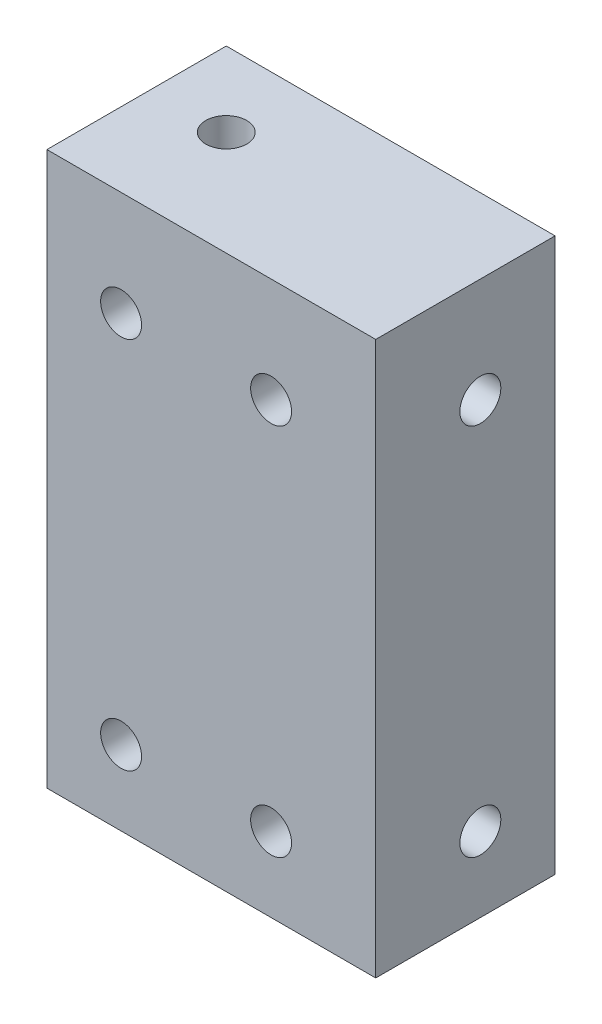
ISO-10303-21;
HEADER;
FILE_DESCRIPTION(('STEP AP214'),'2;1');
FILE_NAME('part.step','',(''),(''),'','','');
FILE_SCHEMA(('AUTOMOTIVE_DESIGN { 1 0 10303 214 1 1 1 1 }'));
ENDSEC;
DATA;
#1=APPLICATION_CONTEXT('core data for automotive mechanical design processes');
#2=APPLICATION_PROTOCOL_DEFINITION('international standard','automotive_design',2000,#1);
#3=PRODUCT_CONTEXT('',#1,'mechanical');
#4=PRODUCT('Part','Part','',(#3));
#5=PRODUCT_RELATED_PRODUCT_CATEGORY('part','',(#4));
#6=PRODUCT_DEFINITION_FORMATION('','',#4);
#7=PRODUCT_DEFINITION_CONTEXT('part definition',#1,'design');
#8=PRODUCT_DEFINITION('design','',#6,#7);
#9=PRODUCT_DEFINITION_SHAPE('','',#8);
#10=(LENGTH_UNIT() NAMED_UNIT(*) SI_UNIT(.MILLI.,.METRE.));
#11=(NAMED_UNIT(*) PLANE_ANGLE_UNIT() SI_UNIT($,.RADIAN.));
#12=(NAMED_UNIT(*) SI_UNIT($,.STERADIAN.) SOLID_ANGLE_UNIT());
#13=UNCERTAINTY_MEASURE_WITH_UNIT(LENGTH_MEASURE(1.E-05),#10,'distance_accuracy_value','');
#14=(GEOMETRIC_REPRESENTATION_CONTEXT(3) GLOBAL_UNCERTAINTY_ASSIGNED_CONTEXT((#13)) GLOBAL_UNIT_ASSIGNED_CONTEXT((#10,
#11,#12)) REPRESENTATION_CONTEXT('',''));
#15=CARTESIAN_POINT('',(0.,0.,0.));
#16=DIRECTION('',(0.,0.,1.));
#17=DIRECTION('',(1.,0.,0.));
#18=AXIS2_PLACEMENT_3D('',#15,#16,#17);
#19=CARTESIAN_POINT('',(0.,0.,4.));
#20=DIRECTION('',(0.,0.,-1.));
#21=DIRECTION('',(-1.,0.,0.));
#22=AXIS2_PLACEMENT_3D('',#19,#20,#21);
#23=PLANE('',#22);
#24=DIRECTION('',(1.,0.,0.));
#25=VECTOR('',#24,1.);
#26=CARTESIAN_POINT('',(-229.06817954727,-521.277483232161,4.));
#27=LINE('',#26,#25);
#28=CARTESIAN_POINT('',(-229.06817954727,-521.277483232161,4.));
#29=VERTEX_POINT('',#28);
#30=CARTESIAN_POINT('',(-185.06817954727,-521.27748323216,3.99999999999999));
#31=VERTEX_POINT('',#30);
#32=EDGE_CURVE('E42',#29,#31,#27,.T.);
#33=ORIENTED_EDGE('',*,*,#32,.T.);
#34=DIRECTION('',(0.,-1.,0.));
#35=VECTOR('',#34,1.);
#36=CARTESIAN_POINT('',(-185.06817954727,-447.27748323216,4.));
#37=LINE('',#36,#35);
#38=CARTESIAN_POINT('',(-185.06817954727,-447.27748323216,4.));
#39=VERTEX_POINT('',#38);
#40=EDGE_CURVE('E144',#39,#31,#37,.T.);
#41=ORIENTED_EDGE('',*,*,#40,.F.);
#42=DIRECTION('',(1.,0.,0.));
#43=VECTOR('',#42,1.);
#44=CARTESIAN_POINT('',(-229.06817954727,-447.27748323216,4.));
#45=LINE('',#44,#43);
#46=CARTESIAN_POINT('',(-229.06817954727,-447.27748323216,4.));
#47=VERTEX_POINT('',#46);
#48=EDGE_CURVE('E127',#47,#39,#45,.T.);
#49=ORIENTED_EDGE('',*,*,#48,.F.);
#50=DIRECTION('',(0.,-1.,0.));
#51=VECTOR('',#50,1.);
#52=CARTESIAN_POINT('',(-229.06817954727,-521.277483232161,4.));
#53=LINE('',#52,#51);
#54=EDGE_CURVE('E49',#47,#29,#53,.T.);
#55=ORIENTED_EDGE('',*,*,#54,.T.);
#56=EDGE_LOOP('',(#33,#41,#49,#55));
#57=FACE_BOUND('',#56,.T.);
#58=CARTESIAN_POINT('',(-199.06817954727,-461.27748323216,4.));
#59=DIRECTION('',(0.,0.,1.));
#60=DIRECTION('',(1.,0.,0.));
#61=AXIS2_PLACEMENT_3D('',#58,#59,#60);
#62=CIRCLE('',#61,2.73999999999999);
#63=CARTESIAN_POINT('',(-196.32817954727,-461.27748323216,4.));
#64=VERTEX_POINT('',#63);
#65=EDGE_CURVE('E88',#64,#64,#62,.T.);
#66=ORIENTED_EDGE('',*,*,#65,.F.);
#67=EDGE_LOOP('',(#66));
#68=FACE_BOUND('',#67,.T.);
#69=CARTESIAN_POINT('',(-219.139101533085,-461.27748323216,4.));
#70=DIRECTION('',(0.,0.,1.));
#71=DIRECTION('',(1.,0.,0.));
#72=AXIS2_PLACEMENT_3D('',#69,#70,#71);
#73=CIRCLE('',#72,2.73999999999999);
#74=CARTESIAN_POINT('',(-216.399101533085,-461.27748323216,4.));
#75=VERTEX_POINT('',#74);
#76=EDGE_CURVE('E93',#75,#75,#73,.T.);
#77=ORIENTED_EDGE('',*,*,#76,.F.);
#78=EDGE_LOOP('',(#77));
#79=FACE_BOUND('',#78,.T.);
#80=CARTESIAN_POINT('',(-219.139101533085,-511.27748323216,4.));
#81=DIRECTION('',(0.,0.,1.));
#82=DIRECTION('',(1.,0.,0.));
#83=AXIS2_PLACEMENT_3D('',#80,#81,#82);
#84=CIRCLE('',#83,2.74000000000006);
#85=CARTESIAN_POINT('',(-216.399101533085,-511.27748323216,4.));
#86=VERTEX_POINT('',#85);
#87=EDGE_CURVE('E99',#86,#86,#84,.T.);
#88=ORIENTED_EDGE('',*,*,#87,.F.);
#89=EDGE_LOOP('',(#88));
#90=FACE_BOUND('',#89,.T.);
#91=CARTESIAN_POINT('',(-199.06817954727,-511.27748323216,4.));
#92=DIRECTION('',(0.,0.,1.));
#93=DIRECTION('',(1.,0.,0.));
#94=AXIS2_PLACEMENT_3D('',#91,#92,#93);
#95=CIRCLE('',#94,2.74000000000009);
#96=CARTESIAN_POINT('',(-196.32817954727,-511.27748323216,4.));
#97=VERTEX_POINT('',#96);
#98=EDGE_CURVE('E105',#97,#97,#95,.T.);
#99=ORIENTED_EDGE('',*,*,#98,.F.);
#100=EDGE_LOOP('',(#99));
#101=FACE_BOUND('',#100,.T.);
#102=ADVANCED_FACE('F33',(#57,#68,#79,#90,#101),#23,.F.);
#103=CARTESIAN_POINT('',(0.,0.,0.));
#104=DIRECTION('',(0.,0.,-1.));
#105=DIRECTION('',(-1.,0.,0.));
#106=AXIS2_PLACEMENT_3D('',#103,#104,#105);
#107=PLANE('',#106);
#108=CARTESIAN_POINT('',(-219.139101533085,-511.27748323216,0.));
#109=DIRECTION('',(0.,0.,1.));
#110=DIRECTION('',(1.,0.,0.));
#111=AXIS2_PLACEMENT_3D('',#108,#109,#110);
#112=CIRCLE('',#111,2.74000000000006);
#113=CARTESIAN_POINT('',(-216.399101533085,-511.27748323216,0.));
#114=VERTEX_POINT('',#113);
#115=EDGE_CURVE('E102',#114,#114,#112,.T.);
#116=ORIENTED_EDGE('',*,*,#115,.T.);
#117=EDGE_LOOP('',(#116));
#118=FACE_BOUND('',#117,.T.);
#119=CARTESIAN_POINT('',(-199.06817954727,-461.27748323216,0.));
#120=DIRECTION('',(0.,0.,1.));
#121=DIRECTION('',(1.,0.,0.));
#122=AXIS2_PLACEMENT_3D('',#119,#120,#121);
#123=CIRCLE('',#122,2.73999999999999);
#124=CARTESIAN_POINT('',(-196.32817954727,-461.27748323216,0.));
#125=VERTEX_POINT('',#124);
#126=EDGE_CURVE('E90',#125,#125,#123,.T.);
#127=ORIENTED_EDGE('',*,*,#126,.T.);
#128=EDGE_LOOP('',(#127));
#129=FACE_BOUND('',#128,.T.);
#130=DIRECTION('',(0.,1.,0.));
#131=VECTOR('',#130,1.);
#132=CARTESIAN_POINT('',(-189.06817954727,-521.277483232161,0.));
#133=LINE('',#132,#131);
#134=CARTESIAN_POINT('',(-189.06817954727,-521.277483232161,0.));
#135=VERTEX_POINT('',#134);
#136=CARTESIAN_POINT('',(-189.06817954727,-451.27748323216,0.));
#137=VERTEX_POINT('',#136);
#138=EDGE_CURVE('E82',#135,#137,#133,.T.);
#139=ORIENTED_EDGE('',*,*,#138,.F.);
#140=DIRECTION('',(1.,0.,0.));
#141=VECTOR('',#140,1.);
#142=CARTESIAN_POINT('',(-229.06817954727,-521.277483232161,0.));
#143=LINE('',#142,#141);
#144=CARTESIAN_POINT('',(-229.06817954727,-521.277483232161,0.));
#145=VERTEX_POINT('',#144);
#146=EDGE_CURVE('E71',#145,#135,#143,.T.);
#147=ORIENTED_EDGE('',*,*,#146,.F.);
#148=DIRECTION('',(0.,-1.,0.));
#149=VECTOR('',#148,1.);
#150=CARTESIAN_POINT('',(-229.06817954727,-521.277483232161,0.));
#151=LINE('',#150,#149);
#152=CARTESIAN_POINT('',(-229.06817954727,-451.27748323216,0.));
#153=VERTEX_POINT('',#152);
#154=EDGE_CURVE('E63',#153,#145,#151,.T.);
#155=ORIENTED_EDGE('',*,*,#154,.F.);
#156=DIRECTION('',(-1.,0.,0.));
#157=VECTOR('',#156,1.);
#158=CARTESIAN_POINT('',(-229.06817954727,-451.27748323216,0.));
#159=LINE('',#158,#157);
#160=EDGE_CURVE('E72',#137,#153,#159,.T.);
#161=ORIENTED_EDGE('',*,*,#160,.F.);
#162=EDGE_LOOP('',(#139,#147,#155,#161));
#163=FACE_BOUND('',#162,.T.);
#164=CARTESIAN_POINT('',(-219.139101533085,-461.27748323216,0.));
#165=DIRECTION('',(0.,0.,1.));
#166=DIRECTION('',(1.,0.,0.));
#167=AXIS2_PLACEMENT_3D('',#164,#165,#166);
#168=CIRCLE('',#167,2.73999999999999);
#169=CARTESIAN_POINT('',(-216.399101533085,-461.27748323216,0.));
#170=VERTEX_POINT('',#169);
#171=EDGE_CURVE('E96',#170,#170,#168,.T.);
#172=ORIENTED_EDGE('',*,*,#171,.T.);
#173=EDGE_LOOP('',(#172));
#174=FACE_BOUND('',#173,.T.);
#175=CARTESIAN_POINT('',(-199.06817954727,-511.27748323216,0.));
#176=DIRECTION('',(0.,0.,1.));
#177=DIRECTION('',(1.,0.,0.));
#178=AXIS2_PLACEMENT_3D('',#175,#176,#177);
#179=CIRCLE('',#178,2.74000000000009);
#180=CARTESIAN_POINT('',(-196.32817954727,-511.27748323216,0.));
#181=VERTEX_POINT('',#180);
#182=EDGE_CURVE('E108',#181,#181,#179,.T.);
#183=ORIENTED_EDGE('',*,*,#182,.T.);
#184=EDGE_LOOP('',(#183));
#185=FACE_BOUND('',#184,.T.);
#186=ADVANCED_FACE('F79',(#118,#129,#163,#174,#185),#107,.T.);
#187=CARTESIAN_POINT('',(-229.06817954727,-521.277483232161,4.));
#188=DIRECTION('',(1.,0.,0.));
#189=DIRECTION('',(0.,1.,0.));
#190=AXIS2_PLACEMENT_3D('',#187,#188,#189);
#191=PLANE('',#190);
#192=ORIENTED_EDGE('',*,*,#154,.T.);
#193=DIRECTION('',(0.,0.,-1.));
#194=VECTOR('',#193,1.);
#195=CARTESIAN_POINT('',(-229.06817954727,-521.277483232161,4.));
#196=LINE('',#195,#194);
#197=EDGE_CURVE('E11',#29,#145,#196,.T.);
#198=ORIENTED_EDGE('',*,*,#197,.F.);
#199=ORIENTED_EDGE('',*,*,#54,.F.);
#200=DIRECTION('',(0.,0.,1.));
#201=VECTOR('',#200,1.);
#202=CARTESIAN_POINT('',(-229.06817954727,-447.27748323216,4.));
#203=LINE('',#202,#201);
#204=CARTESIAN_POINT('',(-229.06817954727,-447.27748323216,-20.));
#205=VERTEX_POINT('',#204);
#206=EDGE_CURVE('E119',#205,#47,#203,.T.);
#207=ORIENTED_EDGE('',*,*,#206,.F.);
#208=DIRECTION('',(0.,-1.,0.));
#209=VECTOR('',#208,1.);
#210=CARTESIAN_POINT('',(-229.06817954727,-447.27748323216,-20.));
#211=LINE('',#210,#209);
#212=CARTESIAN_POINT('',(-229.06817954727,-451.27748323216,-20.));
#213=VERTEX_POINT('',#212);
#214=EDGE_CURVE('E111',#205,#213,#211,.T.);
#215=ORIENTED_EDGE('',*,*,#214,.T.);
#216=DIRECTION('',(0.,0.,1.));
#217=VECTOR('',#216,1.);
#218=CARTESIAN_POINT('',(-229.06817954727,-451.27748323216,4.));
#219=LINE('',#218,#217);
#220=EDGE_CURVE('E67',#213,#153,#219,.T.);
#221=ORIENTED_EDGE('',*,*,#220,.T.);
#222=EDGE_LOOP('',(#192,#198,#199,#207,#215,#221));
#223=FACE_BOUND('',#222,.T.);
#224=ADVANCED_FACE('F35',(#223),#191,.F.);
#225=CARTESIAN_POINT('',(-229.06817954727,-521.277483232161,4.));
#226=DIRECTION('',(0.,1.,0.));
#227=DIRECTION('',(0.,0.,1.));
#228=AXIS2_PLACEMENT_3D('',#225,#226,#227);
#229=PLANE('',#228);
#230=ORIENTED_EDGE('',*,*,#146,.T.);
#231=DIRECTION('',(0.,0.,-1.));
#232=VECTOR('',#231,1.);
#233=CARTESIAN_POINT('',(-189.06817954727,-521.27748323216,3.99999999999999));
#234=LINE('',#233,#232);
#235=CARTESIAN_POINT('',(-189.06817954727,-521.27748323216,-20.));
#236=VERTEX_POINT('',#235);
#237=EDGE_CURVE('E145',#135,#236,#234,.T.);
#238=ORIENTED_EDGE('',*,*,#237,.T.);
#239=DIRECTION('',(-1.,0.,0.));
#240=VECTOR('',#239,1.);
#241=CARTESIAN_POINT('',(-185.06817954727,-521.27748323216,-20.));
#242=LINE('',#241,#240);
#243=CARTESIAN_POINT('',(-185.06817954727,-521.27748323216,-20.));
#244=VERTEX_POINT('',#243);
#245=EDGE_CURVE('E135',#244,#236,#242,.T.);
#246=ORIENTED_EDGE('',*,*,#245,.F.);
#247=DIRECTION('',(0.,0.,-1.));
#248=VECTOR('',#247,1.);
#249=CARTESIAN_POINT('',(-185.06817954727,-521.27748323216,3.99999999999999));
#250=LINE('',#249,#248);
#251=EDGE_CURVE('E153',#31,#244,#250,.T.);
#252=ORIENTED_EDGE('',*,*,#251,.F.);
#253=ORIENTED_EDGE('',*,*,#32,.F.);
#254=ORIENTED_EDGE('',*,*,#197,.T.);
#255=EDGE_LOOP('',(#230,#238,#246,#252,#253,#254));
#256=FACE_BOUND('',#255,.T.);
#257=ADVANCED_FACE('F75',(#256),#229,.F.);
#258=CARTESIAN_POINT('',(-199.06817954727,-461.27748323216,4.));
#259=DIRECTION('',(0.,0.,-1.));
#260=DIRECTION('',(-1.,0.,0.));
#261=AXIS2_PLACEMENT_3D('',#258,#259,#260);
#262=CYLINDRICAL_SURFACE('',#261,2.73999999999999);
#263=ORIENTED_EDGE('',*,*,#65,.T.);
#264=EDGE_LOOP('',(#263));
#265=FACE_BOUND('',#264,.T.);
#266=ORIENTED_EDGE('',*,*,#126,.F.);
#267=EDGE_LOOP('',(#266));
#268=FACE_BOUND('',#267,.T.);
#269=ADVANCED_FACE('F201',(#265,#268),#262,.F.);
#270=CARTESIAN_POINT('',(-219.139101533085,-461.27748323216,4.));
#271=DIRECTION('',(0.,0.,-1.));
#272=DIRECTION('',(-1.,0.,0.));
#273=AXIS2_PLACEMENT_3D('',#270,#271,#272);
#274=CYLINDRICAL_SURFACE('',#273,2.73999999999999);
#275=ORIENTED_EDGE('',*,*,#76,.T.);
#276=EDGE_LOOP('',(#275));
#277=FACE_BOUND('',#276,.T.);
#278=ORIENTED_EDGE('',*,*,#171,.F.);
#279=EDGE_LOOP('',(#278));
#280=FACE_BOUND('',#279,.T.);
#281=ADVANCED_FACE('F208',(#277,#280),#274,.F.);
#282=CARTESIAN_POINT('',(-219.139101533085,-511.27748323216,4.));
#283=DIRECTION('',(0.,0.,-1.));
#284=DIRECTION('',(-1.,0.,0.));
#285=AXIS2_PLACEMENT_3D('',#282,#283,#284);
#286=CYLINDRICAL_SURFACE('',#285,2.74000000000006);
#287=ORIENTED_EDGE('',*,*,#87,.T.);
#288=EDGE_LOOP('',(#287));
#289=FACE_BOUND('',#288,.T.);
#290=ORIENTED_EDGE('',*,*,#115,.F.);
#291=EDGE_LOOP('',(#290));
#292=FACE_BOUND('',#291,.T.);
#293=ADVANCED_FACE('F304',(#289,#292),#286,.F.);
#294=CARTESIAN_POINT('',(-199.06817954727,-511.27748323216,4.));
#295=DIRECTION('',(0.,0.,-1.));
#296=DIRECTION('',(-1.,0.,0.));
#297=AXIS2_PLACEMENT_3D('',#294,#295,#296);
#298=CYLINDRICAL_SURFACE('',#297,2.74000000000009);
#299=ORIENTED_EDGE('',*,*,#98,.T.);
#300=EDGE_LOOP('',(#299));
#301=FACE_BOUND('',#300,.T.);
#302=ORIENTED_EDGE('',*,*,#182,.F.);
#303=EDGE_LOOP('',(#302));
#304=FACE_BOUND('',#303,.T.);
#305=ADVANCED_FACE('F221',(#301,#304),#298,.F.);
#306=CARTESIAN_POINT('',(0.,-447.27748323216,0.));
#307=DIRECTION('',(0.,-1.,0.));
#308=DIRECTION('',(0.,0.,-1.));
#309=AXIS2_PLACEMENT_3D('',#306,#307,#308);
#310=PLANE('',#309);
#311=ORIENTED_EDGE('',*,*,#206,.T.);
#312=ORIENTED_EDGE('',*,*,#48,.T.);
#313=DIRECTION('',(0.,0.,1.));
#314=VECTOR('',#313,1.);
#315=CARTESIAN_POINT('',(-185.06817954727,-447.27748323216,4.));
#316=LINE('',#315,#314);
#317=CARTESIAN_POINT('',(-185.06817954727,-447.27748323216,-20.));
#318=VERTEX_POINT('',#317);
#319=EDGE_CURVE('E140',#318,#39,#316,.T.);
#320=ORIENTED_EDGE('',*,*,#319,.F.);
#321=DIRECTION('',(-1.,0.,0.));
#322=VECTOR('',#321,1.);
#323=CARTESIAN_POINT('',(-229.06817954727,-447.27748323216,-20.));
#324=LINE('',#323,#322);
#325=EDGE_CURVE('E115',#318,#205,#324,.T.);
#326=ORIENTED_EDGE('',*,*,#325,.T.);
#327=EDGE_LOOP('',(#311,#312,#320,#326));
#328=FACE_BOUND('',#327,.T.);
#329=CARTESIAN_POINT('',(-219.06817954727,-447.27748323216,-10.));
#330=DIRECTION('',(0.,1.,0.));
#331=DIRECTION('',(0.,0.,1.));
#332=AXIS2_PLACEMENT_3D('',#329,#330,#331);
#333=CIRCLE('',#332,2.74);
#334=CARTESIAN_POINT('',(-219.06817954727,-447.27748323216,-7.26));
#335=VERTEX_POINT('',#334);
#336=EDGE_CURVE('E124',#335,#335,#333,.T.);
#337=ORIENTED_EDGE('',*,*,#336,.F.);
#338=EDGE_LOOP('',(#337));
#339=FACE_BOUND('',#338,.T.);
#340=ADVANCED_FACE('F251',(#328,#339),#310,.F.);
#341=CARTESIAN_POINT('',(0.,-451.27748323216,0.));
#342=DIRECTION('',(0.,-1.,0.));
#343=DIRECTION('',(0.,0.,-1.));
#344=AXIS2_PLACEMENT_3D('',#341,#342,#343);
#345=PLANE('',#344);
#346=DIRECTION('',(0.,0.,-1.));
#347=VECTOR('',#346,1.);
#348=CARTESIAN_POINT('',(-189.06817954727,-451.27748323216,4.));
#349=LINE('',#348,#347);
#350=CARTESIAN_POINT('',(-189.06817954727,-451.27748323216,-20.));
#351=VERTEX_POINT('',#350);
#352=EDGE_CURVE('E120',#137,#351,#349,.T.);
#353=ORIENTED_EDGE('',*,*,#352,.F.);
#354=ORIENTED_EDGE('',*,*,#160,.T.);
#355=ORIENTED_EDGE('',*,*,#220,.F.);
#356=DIRECTION('',(-1.,0.,0.));
#357=VECTOR('',#356,1.);
#358=CARTESIAN_POINT('',(-229.06817954727,-451.27748323216,-20.));
#359=LINE('',#358,#357);
#360=EDGE_CURVE('E116',#351,#213,#359,.T.);
#361=ORIENTED_EDGE('',*,*,#360,.F.);
#362=EDGE_LOOP('',(#353,#354,#355,#361));
#363=FACE_BOUND('',#362,.T.);
#364=CARTESIAN_POINT('',(-219.06817954727,-451.27748323216,-10.));
#365=DIRECTION('',(0.,1.,0.));
#366=DIRECTION('',(0.,0.,1.));
#367=AXIS2_PLACEMENT_3D('',#364,#365,#366);
#368=CIRCLE('',#367,2.74);
#369=CARTESIAN_POINT('',(-219.06817954727,-451.27748323216,-7.26));
#370=VERTEX_POINT('',#369);
#371=EDGE_CURVE('E132',#370,#370,#368,.T.);
#372=ORIENTED_EDGE('',*,*,#371,.T.);
#373=EDGE_LOOP('',(#372));
#374=FACE_BOUND('',#373,.T.);
#375=ADVANCED_FACE('F254',(#363,#374),#345,.T.);
#376=CARTESIAN_POINT('',(-229.06817954727,-447.27748323216,-20.));
#377=DIRECTION('',(0.,0.,1.));
#378=DIRECTION('',(1.,0.,0.));
#379=AXIS2_PLACEMENT_3D('',#376,#377,#378);
#380=PLANE('',#379);
#381=ORIENTED_EDGE('',*,*,#360,.T.);
#382=ORIENTED_EDGE('',*,*,#214,.F.);
#383=ORIENTED_EDGE('',*,*,#325,.F.);
#384=DIRECTION('',(0.,1.,0.));
#385=VECTOR('',#384,1.);
#386=CARTESIAN_POINT('',(-185.06817954727,-447.27748323216,-20.));
#387=LINE('',#386,#385);
#388=EDGE_CURVE('E150',#244,#318,#387,.T.);
#389=ORIENTED_EDGE('',*,*,#388,.F.);
#390=ORIENTED_EDGE('',*,*,#245,.T.);
#391=DIRECTION('',(0.,1.,0.));
#392=VECTOR('',#391,1.);
#393=CARTESIAN_POINT('',(-189.06817954727,-447.27748323216,-20.));
#394=LINE('',#393,#392);
#395=EDGE_CURVE('E141',#236,#351,#394,.T.);
#396=ORIENTED_EDGE('',*,*,#395,.T.);
#397=EDGE_LOOP('',(#381,#382,#383,#389,#390,#396));
#398=FACE_BOUND('',#397,.T.);
#399=ADVANCED_FACE('F228',(#398),#380,.F.);
#400=CARTESIAN_POINT('',(-219.06817954727,-447.27748323216,-10.));
#401=DIRECTION('',(0.,-1.,0.));
#402=DIRECTION('',(0.,0.,-1.));
#403=AXIS2_PLACEMENT_3D('',#400,#401,#402);
#404=CYLINDRICAL_SURFACE('',#403,2.74);
#405=ORIENTED_EDGE('',*,*,#336,.T.);
#406=EDGE_LOOP('',(#405));
#407=FACE_BOUND('',#406,.T.);
#408=ORIENTED_EDGE('',*,*,#371,.F.);
#409=EDGE_LOOP('',(#408));
#410=FACE_BOUND('',#409,.T.);
#411=ADVANCED_FACE('F185',(#407,#410),#404,.F.);
#412=CARTESIAN_POINT('',(-189.06817954727,0.,0.));
#413=DIRECTION('',(1.,0.,0.));
#414=DIRECTION('',(0.,0.,-1.));
#415=AXIS2_PLACEMENT_3D('',#412,#413,#414);
#416=PLANE('',#415);
#417=CARTESIAN_POINT('',(-189.06817954727,-461.27748323216,-10.));
#418=DIRECTION('',(1.,0.,0.));
#419=DIRECTION('',(0.,0.,-1.));
#420=AXIS2_PLACEMENT_3D('',#417,#418,#419);
#421=CIRCLE('',#420,2.73999999999999);
#422=CARTESIAN_POINT('',(-189.06817954727,-461.27748323216,-12.74));
#423=VERTEX_POINT('',#422);
#424=EDGE_CURVE('E158',#423,#423,#421,.T.);
#425=ORIENTED_EDGE('',*,*,#424,.T.);
#426=EDGE_LOOP('',(#425));
#427=FACE_BOUND('',#426,.T.);
#428=CARTESIAN_POINT('',(-189.06817954727,-511.27748323216,-10.));
#429=DIRECTION('',(1.,0.,0.));
#430=DIRECTION('',(0.,0.,-1.));
#431=AXIS2_PLACEMENT_3D('',#428,#429,#430);
#432=CIRCLE('',#431,2.74000000000002);
#433=CARTESIAN_POINT('',(-189.06817954727,-511.27748323216,-12.74));
#434=VERTEX_POINT('',#433);
#435=EDGE_CURVE('E164',#434,#434,#432,.T.);
#436=ORIENTED_EDGE('',*,*,#435,.T.);
#437=EDGE_LOOP('',(#436));
#438=FACE_BOUND('',#437,.T.);
#439=ORIENTED_EDGE('',*,*,#237,.F.);
#440=ORIENTED_EDGE('',*,*,#138,.T.);
#441=ORIENTED_EDGE('',*,*,#352,.T.);
#442=ORIENTED_EDGE('',*,*,#395,.F.);
#443=EDGE_LOOP('',(#439,#440,#441,#442));
#444=FACE_BOUND('',#443,.T.);
#445=ADVANCED_FACE('F176',(#427,#438,#444),#416,.F.);
#446=CARTESIAN_POINT('',(-185.06817954727,0.,0.));
#447=DIRECTION('',(1.,0.,0.));
#448=DIRECTION('',(0.,0.,-1.));
#449=AXIS2_PLACEMENT_3D('',#446,#447,#448);
#450=PLANE('',#449);
#451=CARTESIAN_POINT('',(-185.06817954727,-461.27748323216,-10.));
#452=DIRECTION('',(1.,0.,0.));
#453=DIRECTION('',(0.,0.,-1.));
#454=AXIS2_PLACEMENT_3D('',#451,#452,#453);
#455=CIRCLE('',#454,2.73999999999999);
#456=CARTESIAN_POINT('',(-185.06817954727,-461.27748323216,-12.74));
#457=VERTEX_POINT('',#456);
#458=EDGE_CURVE('E147',#457,#457,#455,.T.);
#459=ORIENTED_EDGE('',*,*,#458,.F.);
#460=EDGE_LOOP('',(#459));
#461=FACE_BOUND('',#460,.T.);
#462=ORIENTED_EDGE('',*,*,#40,.T.);
#463=ORIENTED_EDGE('',*,*,#251,.T.);
#464=ORIENTED_EDGE('',*,*,#388,.T.);
#465=ORIENTED_EDGE('',*,*,#319,.T.);
#466=EDGE_LOOP('',(#462,#463,#464,#465));
#467=FACE_BOUND('',#466,.T.);
#468=CARTESIAN_POINT('',(-185.06817954727,-511.27748323216,-10.));
#469=DIRECTION('',(1.,0.,0.));
#470=DIRECTION('',(0.,0.,-1.));
#471=AXIS2_PLACEMENT_3D('',#468,#469,#470);
#472=CIRCLE('',#471,2.74000000000002);
#473=CARTESIAN_POINT('',(-185.06817954727,-511.27748323216,-12.74));
#474=VERTEX_POINT('',#473);
#475=EDGE_CURVE('E161',#474,#474,#472,.T.);
#476=ORIENTED_EDGE('',*,*,#475,.F.);
#477=EDGE_LOOP('',(#476));
#478=FACE_BOUND('',#477,.T.);
#479=ADVANCED_FACE('F173',(#461,#467,#478),#450,.T.);
#480=CARTESIAN_POINT('',(-185.06817954727,-461.27748323216,-10.));
#481=DIRECTION('',(-1.,0.,0.));
#482=DIRECTION('',(0.,0.,1.));
#483=AXIS2_PLACEMENT_3D('',#480,#481,#482);
#484=CYLINDRICAL_SURFACE('',#483,2.73999999999999);
#485=ORIENTED_EDGE('',*,*,#458,.T.);
#486=EDGE_LOOP('',(#485));
#487=FACE_BOUND('',#486,.T.);
#488=ORIENTED_EDGE('',*,*,#424,.F.);
#489=EDGE_LOOP('',(#488));
#490=FACE_BOUND('',#489,.T.);
#491=ADVANCED_FACE('F175',(#487,#490),#484,.F.);
#492=CARTESIAN_POINT('',(-185.06817954727,-511.27748323216,-10.));
#493=DIRECTION('',(-1.,0.,0.));
#494=DIRECTION('',(0.,0.,1.));
#495=AXIS2_PLACEMENT_3D('',#492,#493,#494);
#496=CYLINDRICAL_SURFACE('',#495,2.74000000000002);
#497=ORIENTED_EDGE('',*,*,#475,.T.);
#498=EDGE_LOOP('',(#497));
#499=FACE_BOUND('',#498,.T.);
#500=ORIENTED_EDGE('',*,*,#435,.F.);
#501=EDGE_LOOP('',(#500));
#502=FACE_BOUND('',#501,.T.);
#503=ADVANCED_FACE('F170',(#499,#502),#496,.F.);
#504=CLOSED_SHELL('',(#102,#186,#224,#257,#269,#281,#293,#305,#340,#375,#399,#411,#445,#479,
#491,#503));
#505=MANIFOLD_SOLID_BREP('B2',#504);
#506=ADVANCED_BREP_SHAPE_REPRESENTATION('',(#18,#505),#14);
#507=SHAPE_DEFINITION_REPRESENTATION(#9,#506);
ENDSEC;
END-ISO-10303-21;
